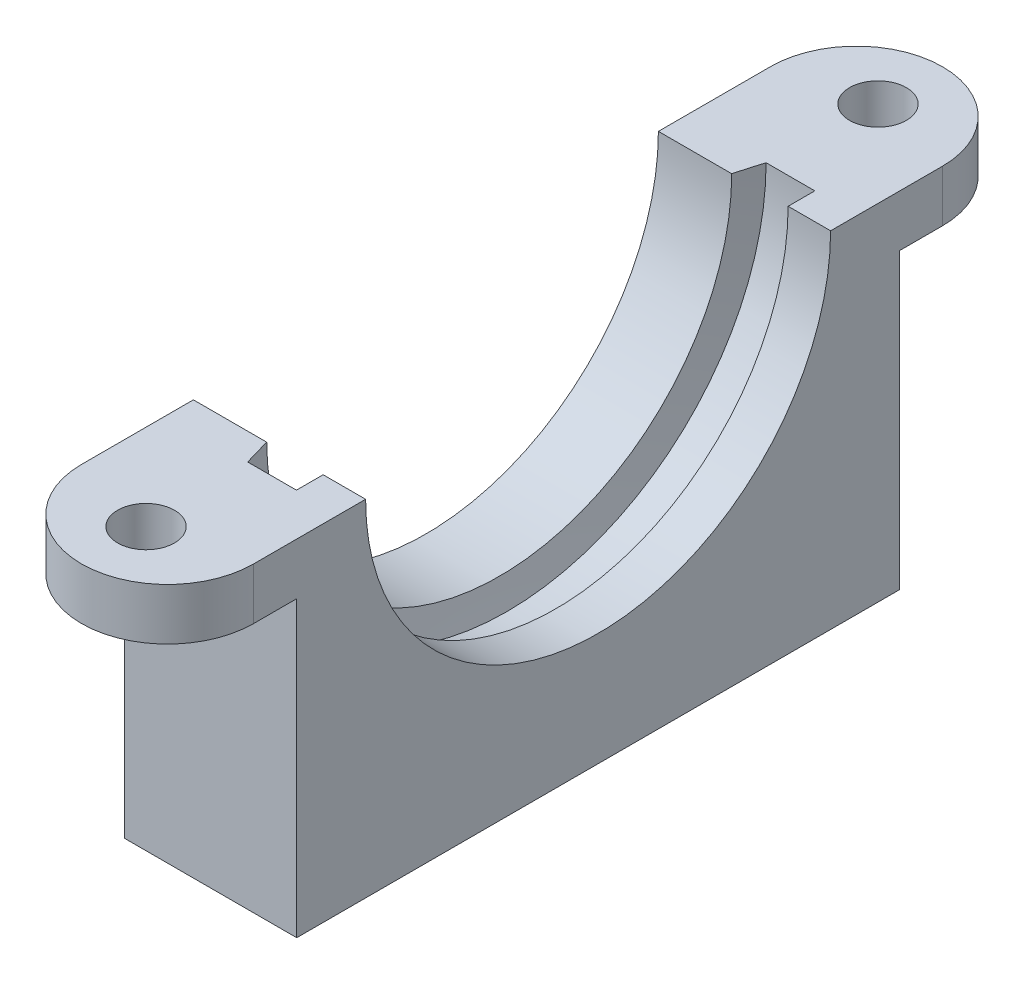
ISO-10303-21;
HEADER;
FILE_DESCRIPTION(('STEP AP214'),'2;1');
FILE_NAME('part.step','',(''),(''),'','','');
FILE_SCHEMA(('AUTOMOTIVE_DESIGN { 1 0 10303 214 1 1 1 1 }'));
ENDSEC;
DATA;
#1=APPLICATION_CONTEXT('core data for automotive mechanical design processes');
#2=APPLICATION_PROTOCOL_DEFINITION('international standard','automotive_design',2000,#1);
#3=PRODUCT_CONTEXT('',#1,'mechanical');
#4=PRODUCT('Part','Part','',(#3));
#5=PRODUCT_RELATED_PRODUCT_CATEGORY('part','',(#4));
#6=PRODUCT_DEFINITION_FORMATION('','',#4);
#7=PRODUCT_DEFINITION_CONTEXT('part definition',#1,'design');
#8=PRODUCT_DEFINITION('design','',#6,#7);
#9=PRODUCT_DEFINITION_SHAPE('','',#8);
#10=(LENGTH_UNIT() NAMED_UNIT(*) SI_UNIT(.MILLI.,.METRE.));
#11=(NAMED_UNIT(*) PLANE_ANGLE_UNIT() SI_UNIT($,.RADIAN.));
#12=(NAMED_UNIT(*) SI_UNIT($,.STERADIAN.) SOLID_ANGLE_UNIT());
#13=UNCERTAINTY_MEASURE_WITH_UNIT(LENGTH_MEASURE(1.E-05),#10,'distance_accuracy_value','');
#14=(GEOMETRIC_REPRESENTATION_CONTEXT(3) GLOBAL_UNCERTAINTY_ASSIGNED_CONTEXT((#13)) GLOBAL_UNIT_ASSIGNED_CONTEXT((#10,
#11,#12)) REPRESENTATION_CONTEXT('',''));
#15=CARTESIAN_POINT('',(0.,0.,0.));
#16=DIRECTION('',(0.,0.,1.));
#17=DIRECTION('',(1.,0.,0.));
#18=AXIS2_PLACEMENT_3D('',#15,#16,#17);
#19=CARTESIAN_POINT('',(0.,0.,-17.5));
#20=DIRECTION('',(0.,0.,-1.));
#21=DIRECTION('',(-1.,0.,0.));
#22=AXIS2_PLACEMENT_3D('',#19,#20,#21);
#23=PLANE('',#22);
#24=DIRECTION('',(0.,-1.,0.));
#25=VECTOR('',#24,1.);
#26=CARTESIAN_POINT('',(-7.53383666100945,0.,-17.5));
#27=LINE('',#26,#25);
#28=CARTESIAN_POINT('',(-7.53383666100945,-3.,-17.5));
#29=VERTEX_POINT('',#28);
#30=CARTESIAN_POINT('',(-7.53383666100945,-20.05,-17.5));
#31=VERTEX_POINT('',#30);
#32=EDGE_CURVE('E157',#29,#31,#27,.T.);
#33=ORIENTED_EDGE('',*,*,#32,.F.);
#34=DIRECTION('',(1.,0.,0.));
#35=VECTOR('',#34,1.);
#36=CARTESIAN_POINT('',(2.46616333899055,-3.,-17.5));
#37=LINE('',#36,#35);
#38=CARTESIAN_POINT('',(2.46616333899055,-3.,-17.5));
#39=VERTEX_POINT('',#38);
#40=EDGE_CURVE('E234',#29,#39,#37,.T.);
#41=ORIENTED_EDGE('',*,*,#40,.T.);
#42=DIRECTION('',(0.,-1.,0.));
#43=VECTOR('',#42,1.);
#44=CARTESIAN_POINT('',(2.46616333899055,0.,-17.5));
#45=LINE('',#44,#43);
#46=CARTESIAN_POINT('',(2.46616333899055,-20.05,-17.5));
#47=VERTEX_POINT('',#46);
#48=EDGE_CURVE('E169',#39,#47,#45,.T.);
#49=ORIENTED_EDGE('',*,*,#48,.T.);
#50=DIRECTION('',(1.,0.,0.));
#51=VECTOR('',#50,1.);
#52=CARTESIAN_POINT('',(-7.53383666100945,-20.05,-17.5));
#53=LINE('',#52,#51);
#54=EDGE_CURVE('E161',#31,#47,#53,.T.);
#55=ORIENTED_EDGE('',*,*,#54,.F.);
#56=EDGE_LOOP('',(#33,#41,#49,#55));
#57=FACE_BOUND('',#56,.T.);
#58=ADVANCED_FACE('F33',(#57),#23,.T.);
#59=CARTESIAN_POINT('',(-7.53383666100945,0.,17.5));
#60=DIRECTION('',(0.,1.,0.));
#61=DIRECTION('',(-1.,0.,0.));
#62=AXIS2_PLACEMENT_3D('',#59,#60,#61);
#63=PLANE('',#62);
#64=DIRECTION('',(-1.,0.,0.));
#65=VECTOR('',#64,1.);
#66=CARTESIAN_POINT('',(2.46616333899055,0.,-13.5));
#67=LINE('',#66,#65);
#68=CARTESIAN_POINT('',(2.46616333899055,0.,-13.5));
#69=VERTEX_POINT('',#68);
#70=CARTESIAN_POINT('',(0.,0.,-13.5));
#71=VERTEX_POINT('',#70);
#72=EDGE_CURVE('E220',#69,#71,#67,.T.);
#73=ORIENTED_EDGE('',*,*,#72,.F.);
#74=DIRECTION('',(0.,0.,-1.));
#75=VECTOR('',#74,1.);
#76=CARTESIAN_POINT('',(2.46616333899055,0.,17.5));
#77=LINE('',#76,#75);
#78=CARTESIAN_POINT('',(2.46616333899054,0.,-20.));
#79=VERTEX_POINT('',#78);
#80=EDGE_CURVE('E168',#69,#79,#77,.T.);
#81=ORIENTED_EDGE('',*,*,#80,.T.);
#82=CARTESIAN_POINT('',(-2.53383666100945,0.,-20.));
#83=DIRECTION('',(0.,1.,0.));
#84=DIRECTION('',(1.,0.,0.));
#85=AXIS2_PLACEMENT_3D('',#82,#83,#84);
#86=CIRCLE('',#85,4.99999999999999);
#87=CARTESIAN_POINT('',(-7.53383666100945,0.,-20.));
#88=VERTEX_POINT('',#87);
#89=EDGE_CURVE('E237',#79,#88,#86,.T.);
#90=ORIENTED_EDGE('',*,*,#89,.T.);
#91=DIRECTION('',(0.,0.,-1.));
#92=VECTOR('',#91,1.);
#93=CARTESIAN_POINT('',(-7.53383666100945,0.,17.5));
#94=LINE('',#93,#92);
#95=CARTESIAN_POINT('',(-7.53383666100945,0.,-13.5));
#96=VERTEX_POINT('',#95);
#97=EDGE_CURVE('E177',#96,#88,#94,.T.);
#98=ORIENTED_EDGE('',*,*,#97,.F.);
#99=CARTESIAN_POINT('',(-3.275063121647,0.,-13.5));
#100=VERTEX_POINT('',#99);
#101=EDGE_CURVE('E207',#100,#96,#67,.T.);
#102=ORIENTED_EDGE('',*,*,#101,.F.);
#103=CARTESIAN_POINT('',(46.6623266779811,0.,0.));
#104=DIRECTION('',(0.,1.,0.));
#105=DIRECTION('',(-1.,0.,0.));
#106=AXIS2_PLACEMENT_3D('',#103,#104,#105);
#107=CIRCLE('',#106,51.73);
#108=CARTESIAN_POINT('',(-2.83,0.,-15.05));
#109=VERTEX_POINT('',#108);
#110=EDGE_CURVE('E194',#100,#109,#107,.F.);
#111=ORIENTED_EDGE('',*,*,#110,.T.);
#112=DIRECTION('',(1.,0.,0.));
#113=VECTOR('',#112,1.);
#114=CARTESIAN_POINT('',(0.,0.,-15.05));
#115=LINE('',#114,#113);
#116=CARTESIAN_POINT('',(0.,0.,-15.05));
#117=VERTEX_POINT('',#116);
#118=EDGE_CURVE('E189',#117,#109,#115,.F.);
#119=ORIENTED_EDGE('',*,*,#118,.F.);
#120=DIRECTION('',(0.,0.,1.));
#121=VECTOR('',#120,1.);
#122=CARTESIAN_POINT('',(0.,0.,17.5));
#123=LINE('',#122,#121);
#124=EDGE_CURVE('E186',#117,#71,#123,.T.);
#125=ORIENTED_EDGE('',*,*,#124,.T.);
#126=EDGE_LOOP('',(#73,#81,#90,#98,#102,#111,#119,#125));
#127=FACE_BOUND('',#126,.T.);
#128=CARTESIAN_POINT('',(-2.53383666100945,0.,-21.25));
#129=DIRECTION('',(0.,1.,0.));
#130=DIRECTION('',(-1.,0.,0.));
#131=AXIS2_PLACEMENT_3D('',#128,#129,#130);
#132=CIRCLE('',#131,1.65);
#133=CARTESIAN_POINT('',(-4.18383666100945,0.,-21.25));
#134=VERTEX_POINT('',#133);
#135=EDGE_CURVE('E248',#134,#134,#132,.T.);
#136=ORIENTED_EDGE('',*,*,#135,.F.);
#137=EDGE_LOOP('',(#136));
#138=FACE_BOUND('',#137,.T.);
#139=ADVANCED_FACE('F204',(#127,#138),#63,.T.);
#140=DIRECTION('',(-1.,0.,0.));
#141=VECTOR('',#140,1.);
#142=CARTESIAN_POINT('',(2.46616333899055,0.,13.5));
#143=LINE('',#142,#141);
#144=CARTESIAN_POINT('',(-7.53383666100945,0.,13.5));
#145=VERTEX_POINT('',#144);
#146=CARTESIAN_POINT('',(-3.275063121647,0.,13.5));
#147=VERTEX_POINT('',#146);
#148=EDGE_CURVE('E218',#145,#147,#143,.F.);
#149=ORIENTED_EDGE('',*,*,#148,.F.);
#150=CARTESIAN_POINT('',(-7.53383666100945,0.,20.));
#151=VERTEX_POINT('',#150);
#152=EDGE_CURVE('E173',#151,#145,#94,.T.);
#153=ORIENTED_EDGE('',*,*,#152,.F.);
#154=CARTESIAN_POINT('',(-2.53383666100945,0.,20.));
#155=DIRECTION('',(0.,1.,0.));
#156=DIRECTION('',(1.,0.,0.));
#157=AXIS2_PLACEMENT_3D('',#154,#155,#156);
#158=CIRCLE('',#157,5.);
#159=CARTESIAN_POINT('',(2.46616333899055,0.,20.));
#160=VERTEX_POINT('',#159);
#161=EDGE_CURVE('E151',#151,#160,#158,.T.);
#162=ORIENTED_EDGE('',*,*,#161,.T.);
#163=CARTESIAN_POINT('',(2.46616333899055,0.,13.5));
#164=VERTEX_POINT('',#163);
#165=EDGE_CURVE('E183',#160,#164,#77,.T.);
#166=ORIENTED_EDGE('',*,*,#165,.T.);
#167=CARTESIAN_POINT('',(0.,0.,13.5));
#168=VERTEX_POINT('',#167);
#169=EDGE_CURVE('E224',#168,#164,#143,.F.);
#170=ORIENTED_EDGE('',*,*,#169,.F.);
#171=CARTESIAN_POINT('',(0.,0.,15.05));
#172=VERTEX_POINT('',#171);
#173=EDGE_CURVE('E176',#168,#172,#123,.T.);
#174=ORIENTED_EDGE('',*,*,#173,.T.);
#175=DIRECTION('',(1.,0.,0.));
#176=VECTOR('',#175,1.);
#177=CARTESIAN_POINT('',(0.,0.,15.05));
#178=LINE('',#177,#176);
#179=CARTESIAN_POINT('',(-2.83,0.,15.05));
#180=VERTEX_POINT('',#179);
#181=EDGE_CURVE('E192',#180,#172,#178,.T.);
#182=ORIENTED_EDGE('',*,*,#181,.F.);
#183=EDGE_CURVE('E41',#180,#147,#107,.F.);
#184=ORIENTED_EDGE('',*,*,#183,.T.);
#185=EDGE_LOOP('',(#149,#153,#162,#166,#170,#174,#182,#184));
#186=FACE_BOUND('',#185,.T.);
#187=CARTESIAN_POINT('',(-2.53383666100945,0.,21.25));
#188=DIRECTION('',(0.,1.,0.));
#189=DIRECTION('',(-1.,0.,0.));
#190=AXIS2_PLACEMENT_3D('',#187,#188,#189);
#191=CIRCLE('',#190,1.65);
#192=CARTESIAN_POINT('',(-4.18383666100945,0.,21.25));
#193=VERTEX_POINT('',#192);
#194=EDGE_CURVE('E263',#193,#193,#191,.T.);
#195=ORIENTED_EDGE('',*,*,#194,.F.);
#196=EDGE_LOOP('',(#195));
#197=FACE_BOUND('',#196,.T.);
#198=ADVANCED_FACE('F35',(#186,#197),#63,.T.);
#199=CARTESIAN_POINT('',(-7.53383666100945,0.,17.5));
#200=DIRECTION('',(1.,0.,0.));
#201=DIRECTION('',(0.,1.,0.));
#202=AXIS2_PLACEMENT_3D('',#199,#200,#201);
#203=PLANE('',#202);
#204=ORIENTED_EDGE('',*,*,#152,.T.);
#205=CARTESIAN_POINT('',(-7.53383666100945,0.,0.));
#206=DIRECTION('',(-1.,0.,0.));
#207=DIRECTION('',(0.,-1.,0.));
#208=AXIS2_PLACEMENT_3D('',#205,#206,#207);
#209=CIRCLE('',#208,13.5);
#210=EDGE_CURVE('E227',#96,#145,#209,.T.);
#211=ORIENTED_EDGE('',*,*,#210,.F.);
#212=ORIENTED_EDGE('',*,*,#97,.T.);
#213=DIRECTION('',(0.,1.,0.));
#214=VECTOR('',#213,1.);
#215=CARTESIAN_POINT('',(-7.53383666100945,-3.,-20.));
#216=LINE('',#215,#214);
#217=CARTESIAN_POINT('',(-7.53383666100945,-3.,-20.));
#218=VERTEX_POINT('',#217);
#219=EDGE_CURVE('E229',#218,#88,#216,.T.);
#220=ORIENTED_EDGE('',*,*,#219,.F.);
#221=DIRECTION('',(0.,0.,1.));
#222=VECTOR('',#221,1.);
#223=CARTESIAN_POINT('',(-7.53383666100945,-3.,-17.5));
#224=LINE('',#223,#222);
#225=EDGE_CURVE('E242',#218,#29,#224,.T.);
#226=ORIENTED_EDGE('',*,*,#225,.T.);
#227=ORIENTED_EDGE('',*,*,#32,.T.);
#228=DIRECTION('',(0.,0.,-1.));
#229=VECTOR('',#228,1.);
#230=CARTESIAN_POINT('',(-7.53383666100945,-20.05,17.5));
#231=LINE('',#230,#229);
#232=CARTESIAN_POINT('',(-7.53383666100945,-20.05,17.5));
#233=VERTEX_POINT('',#232);
#234=EDGE_CURVE('E178',#233,#31,#231,.T.);
#235=ORIENTED_EDGE('',*,*,#234,.F.);
#236=DIRECTION('',(0.,-1.,0.));
#237=VECTOR('',#236,1.);
#238=CARTESIAN_POINT('',(-7.53383666100945,0.,17.5));
#239=LINE('',#238,#237);
#240=CARTESIAN_POINT('',(-7.53383666100945,-3.,17.5));
#241=VERTEX_POINT('',#240);
#242=EDGE_CURVE('E159',#241,#233,#239,.T.);
#243=ORIENTED_EDGE('',*,*,#242,.F.);
#244=DIRECTION('',(0.,0.,1.));
#245=VECTOR('',#244,1.);
#246=CARTESIAN_POINT('',(-7.53383666100945,-3.,17.5));
#247=LINE('',#246,#245);
#248=CARTESIAN_POINT('',(-7.53383666100945,-3.,20.));
#249=VERTEX_POINT('',#248);
#250=EDGE_CURVE('E48',#241,#249,#247,.T.);
#251=ORIENTED_EDGE('',*,*,#250,.T.);
#252=DIRECTION('',(0.,1.,0.));
#253=VECTOR('',#252,1.);
#254=CARTESIAN_POINT('',(-7.53383666100945,-3.,20.));
#255=LINE('',#254,#253);
#256=EDGE_CURVE('E253',#249,#151,#255,.T.);
#257=ORIENTED_EDGE('',*,*,#256,.T.);
#258=EDGE_LOOP('',(#204,#211,#212,#220,#226,#227,#235,#243,#251,#257));
#259=FACE_BOUND('',#258,.T.);
#260=ADVANCED_FACE('F277',(#259),#203,.F.);
#261=CARTESIAN_POINT('',(-7.53383666100945,-20.05,17.5));
#262=DIRECTION('',(0.,1.,0.));
#263=DIRECTION('',(0.,0.,1.));
#264=AXIS2_PLACEMENT_3D('',#261,#262,#263);
#265=PLANE('',#264);
#266=ORIENTED_EDGE('',*,*,#54,.T.);
#267=DIRECTION('',(0.,0.,-1.));
#268=VECTOR('',#267,1.);
#269=CARTESIAN_POINT('',(2.46616333899055,-20.05,17.5));
#270=LINE('',#269,#268);
#271=CARTESIAN_POINT('',(2.46616333899055,-20.05,17.5));
#272=VERTEX_POINT('',#271);
#273=EDGE_CURVE('E181',#272,#47,#270,.T.);
#274=ORIENTED_EDGE('',*,*,#273,.F.);
#275=DIRECTION('',(1.,0.,0.));
#276=VECTOR('',#275,1.);
#277=CARTESIAN_POINT('',(-7.53383666100945,-20.05,17.5));
#278=LINE('',#277,#276);
#279=EDGE_CURVE('E155',#233,#272,#278,.T.);
#280=ORIENTED_EDGE('',*,*,#279,.F.);
#281=ORIENTED_EDGE('',*,*,#234,.T.);
#282=EDGE_LOOP('',(#266,#274,#280,#281));
#283=FACE_BOUND('',#282,.T.);
#284=ADVANCED_FACE('F282',(#283),#265,.F.);
#285=CARTESIAN_POINT('',(2.46616333899055,0.,17.5));
#286=DIRECTION('',(1.,0.,0.));
#287=DIRECTION('',(0.,1.,0.));
#288=AXIS2_PLACEMENT_3D('',#285,#286,#287);
#289=PLANE('',#288);
#290=CARTESIAN_POINT('',(2.46616333899055,0.,0.));
#291=DIRECTION('',(-1.,0.,0.));
#292=DIRECTION('',(0.,-1.,0.));
#293=AXIS2_PLACEMENT_3D('',#290,#291,#292);
#294=CIRCLE('',#293,13.5);
#295=EDGE_CURVE('E226',#69,#164,#294,.T.);
#296=ORIENTED_EDGE('',*,*,#295,.T.);
#297=ORIENTED_EDGE('',*,*,#165,.F.);
#298=DIRECTION('',(0.,1.,0.));
#299=VECTOR('',#298,1.);
#300=CARTESIAN_POINT('',(2.46616333899055,-3.,20.));
#301=LINE('',#300,#299);
#302=CARTESIAN_POINT('',(2.46616333899055,-3.,20.));
#303=VERTEX_POINT('',#302);
#304=EDGE_CURVE('E150',#303,#160,#301,.T.);
#305=ORIENTED_EDGE('',*,*,#304,.F.);
#306=DIRECTION('',(0.,0.,-1.));
#307=VECTOR('',#306,1.);
#308=CARTESIAN_POINT('',(2.46616333899055,-3.,17.5));
#309=LINE('',#308,#307);
#310=CARTESIAN_POINT('',(2.46616333899055,-3.,17.5));
#311=VERTEX_POINT('',#310);
#312=EDGE_CURVE('E137',#303,#311,#309,.T.);
#313=ORIENTED_EDGE('',*,*,#312,.T.);
#314=DIRECTION('',(0.,-1.,0.));
#315=VECTOR('',#314,1.);
#316=CARTESIAN_POINT('',(2.46616333899055,0.,17.5));
#317=LINE('',#316,#315);
#318=EDGE_CURVE('E147',#311,#272,#317,.T.);
#319=ORIENTED_EDGE('',*,*,#318,.T.);
#320=ORIENTED_EDGE('',*,*,#273,.T.);
#321=ORIENTED_EDGE('',*,*,#48,.F.);
#322=DIRECTION('',(0.,0.,-1.));
#323=VECTOR('',#322,1.);
#324=CARTESIAN_POINT('',(2.46616333899055,-3.,-17.5));
#325=LINE('',#324,#323);
#326=CARTESIAN_POINT('',(2.46616333899054,-3.,-20.));
#327=VERTEX_POINT('',#326);
#328=EDGE_CURVE('E56',#39,#327,#325,.T.);
#329=ORIENTED_EDGE('',*,*,#328,.T.);
#330=DIRECTION('',(0.,1.,0.));
#331=VECTOR('',#330,1.);
#332=CARTESIAN_POINT('',(2.46616333899054,-3.,-20.));
#333=LINE('',#332,#331);
#334=EDGE_CURVE('E231',#327,#79,#333,.T.);
#335=ORIENTED_EDGE('',*,*,#334,.T.);
#336=ORIENTED_EDGE('',*,*,#80,.F.);
#337=EDGE_LOOP('',(#296,#297,#305,#313,#319,#320,#321,#329,#335,#336));
#338=FACE_BOUND('',#337,.T.);
#339=ADVANCED_FACE('F145',(#338),#289,.T.);
#340=CARTESIAN_POINT('',(0.,0.,17.5));
#341=DIRECTION('',(0.,0.,-1.));
#342=DIRECTION('',(-1.,0.,0.));
#343=AXIS2_PLACEMENT_3D('',#340,#341,#342);
#344=PLANE('',#343);
#345=ORIENTED_EDGE('',*,*,#318,.F.);
#346=DIRECTION('',(-1.,0.,0.));
#347=VECTOR('',#346,1.);
#348=CARTESIAN_POINT('',(2.46616333899055,-3.,17.5));
#349=LINE('',#348,#347);
#350=EDGE_CURVE('E134',#311,#241,#349,.T.);
#351=ORIENTED_EDGE('',*,*,#350,.T.);
#352=ORIENTED_EDGE('',*,*,#242,.T.);
#353=ORIENTED_EDGE('',*,*,#279,.T.);
#354=EDGE_LOOP('',(#345,#351,#352,#353));
#355=FACE_BOUND('',#354,.T.);
#356=ADVANCED_FACE('F153',(#355),#344,.F.);
#357=CARTESIAN_POINT('',(46.6623266779811,0.,0.));
#358=DIRECTION('',(1.,0.,0.));
#359=DIRECTION('',(0.,1.,0.));
#360=AXIS2_PLACEMENT_3D('',#357,#358,#359);
#361=SPHERICAL_SURFACE('',#360,51.73);
#362=CARTESIAN_POINT('',(-3.275063121647,0.,0.));
#363=DIRECTION('',(1.,0.,0.));
#364=DIRECTION('',(0.,1.,0.));
#365=AXIS2_PLACEMENT_3D('',#362,#363,#364);
#366=CIRCLE('',#365,13.5);
#367=EDGE_CURVE('E222',#147,#100,#366,.T.);
#368=ORIENTED_EDGE('',*,*,#367,.F.);
#369=ORIENTED_EDGE('',*,*,#183,.F.);
#370=CARTESIAN_POINT('',(-2.83,0.,0.));
#371=DIRECTION('',(1.,0.,0.));
#372=DIRECTION('',(0.,0.,-1.));
#373=AXIS2_PLACEMENT_3D('',#370,#371,#372);
#374=CIRCLE('',#373,15.05);
#375=EDGE_CURVE('E164',#180,#109,#374,.T.);
#376=ORIENTED_EDGE('',*,*,#375,.T.);
#377=ORIENTED_EDGE('',*,*,#110,.F.);
#378=EDGE_LOOP('',(#368,#369,#376,#377));
#379=FACE_BOUND('',#378,.T.);
#380=ADVANCED_FACE('F217',(#379),#361,.F.);
#381=CARTESIAN_POINT('',(0.,0.,0.));
#382=DIRECTION('',(1.,0.,0.));
#383=DIRECTION('',(0.,0.,-1.));
#384=AXIS2_PLACEMENT_3D('',#381,#382,#383);
#385=CYLINDRICAL_SURFACE('',#384,15.05);
#386=ORIENTED_EDGE('',*,*,#181,.T.);
#387=CARTESIAN_POINT('',(0.,0.,0.));
#388=DIRECTION('',(1.,0.,0.));
#389=DIRECTION('',(0.,0.,-1.));
#390=AXIS2_PLACEMENT_3D('',#387,#388,#389);
#391=CIRCLE('',#390,15.05);
#392=EDGE_CURVE('E216',#172,#117,#391,.T.);
#393=ORIENTED_EDGE('',*,*,#392,.T.);
#394=ORIENTED_EDGE('',*,*,#118,.T.);
#395=ORIENTED_EDGE('',*,*,#375,.F.);
#396=EDGE_LOOP('',(#386,#393,#394,#395));
#397=FACE_BOUND('',#396,.T.);
#398=ADVANCED_FACE('F214',(#397),#385,.F.);
#399=CARTESIAN_POINT('',(0.,15.05,0.));
#400=DIRECTION('',(-1.,0.,0.));
#401=DIRECTION('',(0.,0.,1.));
#402=AXIS2_PLACEMENT_3D('',#399,#400,#401);
#403=PLANE('',#402);
#404=CARTESIAN_POINT('',(0.,0.,0.));
#405=DIRECTION('',(-1.,0.,0.));
#406=DIRECTION('',(0.,0.,1.));
#407=AXIS2_PLACEMENT_3D('',#404,#405,#406);
#408=CIRCLE('',#407,13.5);
#409=EDGE_CURVE('E11',#71,#168,#408,.T.);
#410=ORIENTED_EDGE('',*,*,#409,.F.);
#411=ORIENTED_EDGE('',*,*,#124,.F.);
#412=ORIENTED_EDGE('',*,*,#392,.F.);
#413=ORIENTED_EDGE('',*,*,#173,.F.);
#414=EDGE_LOOP('',(#410,#411,#412,#413));
#415=FACE_BOUND('',#414,.T.);
#416=ADVANCED_FACE('F306',(#415),#403,.T.);
#417=CARTESIAN_POINT('',(2.46616333899055,0.,0.));
#418=DIRECTION('',(-1.,0.,0.));
#419=DIRECTION('',(0.,-1.,0.));
#420=AXIS2_PLACEMENT_3D('',#417,#418,#419);
#421=CYLINDRICAL_SURFACE('',#420,13.5);
#422=ORIENTED_EDGE('',*,*,#72,.T.);
#423=ORIENTED_EDGE('',*,*,#409,.T.);
#424=ORIENTED_EDGE('',*,*,#169,.T.);
#425=ORIENTED_EDGE('',*,*,#295,.F.);
#426=EDGE_LOOP('',(#422,#423,#424,#425));
#427=FACE_BOUND('',#426,.T.);
#428=ADVANCED_FACE('F311',(#427),#421,.F.);
#429=ORIENTED_EDGE('',*,*,#101,.T.);
#430=ORIENTED_EDGE('',*,*,#210,.T.);
#431=ORIENTED_EDGE('',*,*,#148,.T.);
#432=ORIENTED_EDGE('',*,*,#367,.T.);
#433=EDGE_LOOP('',(#429,#430,#431,#432));
#434=FACE_BOUND('',#433,.T.);
#435=ADVANCED_FACE('F315',(#434),#421,.F.);
#436=CARTESIAN_POINT('',(-2.53383666100945,-3.,-20.));
#437=DIRECTION('',(0.,1.,0.));
#438=DIRECTION('',(-1.,0.,0.));
#439=AXIS2_PLACEMENT_3D('',#436,#437,#438);
#440=CYLINDRICAL_SURFACE('',#439,4.99999999999999);
#441=ORIENTED_EDGE('',*,*,#89,.F.);
#442=ORIENTED_EDGE('',*,*,#334,.F.);
#443=CARTESIAN_POINT('',(-2.53383666100945,-3.,-20.));
#444=DIRECTION('',(0.,1.,0.));
#445=DIRECTION('',(1.,0.,0.));
#446=AXIS2_PLACEMENT_3D('',#443,#444,#445);
#447=CIRCLE('',#446,4.99999999999999);
#448=EDGE_CURVE('E244',#327,#218,#447,.T.);
#449=ORIENTED_EDGE('',*,*,#448,.T.);
#450=ORIENTED_EDGE('',*,*,#219,.T.);
#451=EDGE_LOOP('',(#441,#442,#449,#450));
#452=FACE_BOUND('',#451,.T.);
#453=ADVANCED_FACE('F317',(#452),#440,.T.);
#454=CARTESIAN_POINT('',(-2.53383666100945,-3.,-20.));
#455=DIRECTION('',(0.,-1.,0.));
#456=DIRECTION('',(1.,0.,0.));
#457=AXIS2_PLACEMENT_3D('',#454,#455,#456);
#458=PLANE('',#457);
#459=CARTESIAN_POINT('',(-2.53383666100945,-3.,-21.25));
#460=DIRECTION('',(0.,1.,0.));
#461=DIRECTION('',(-1.,0.,0.));
#462=AXIS2_PLACEMENT_3D('',#459,#460,#461);
#463=CIRCLE('',#462,1.65);
#464=CARTESIAN_POINT('',(-4.18383666100945,-3.,-21.25));
#465=VERTEX_POINT('',#464);
#466=EDGE_CURVE('E240',#465,#465,#463,.T.);
#467=ORIENTED_EDGE('',*,*,#466,.T.);
#468=EDGE_LOOP('',(#467));
#469=FACE_BOUND('',#468,.T.);
#470=ORIENTED_EDGE('',*,*,#328,.F.);
#471=ORIENTED_EDGE('',*,*,#40,.F.);
#472=ORIENTED_EDGE('',*,*,#225,.F.);
#473=ORIENTED_EDGE('',*,*,#448,.F.);
#474=EDGE_LOOP('',(#470,#471,#472,#473));
#475=FACE_BOUND('',#474,.T.);
#476=ADVANCED_FACE('F320',(#469,#475),#458,.T.);
#477=CARTESIAN_POINT('',(-2.53383666100945,-3.,-21.25));
#478=DIRECTION('',(0.,1.,0.));
#479=DIRECTION('',(-1.,0.,0.));
#480=AXIS2_PLACEMENT_3D('',#477,#478,#479);
#481=CYLINDRICAL_SURFACE('',#480,1.65);
#482=ORIENTED_EDGE('',*,*,#466,.F.);
#483=EDGE_LOOP('',(#482));
#484=FACE_BOUND('',#483,.T.);
#485=ORIENTED_EDGE('',*,*,#135,.T.);
#486=EDGE_LOOP('',(#485));
#487=FACE_BOUND('',#486,.T.);
#488=ADVANCED_FACE('F324',(#484,#487),#481,.F.);
#489=CARTESIAN_POINT('',(-2.53383666100945,-3.,20.));
#490=DIRECTION('',(0.,1.,0.));
#491=DIRECTION('',(-1.,0.,0.));
#492=AXIS2_PLACEMENT_3D('',#489,#490,#491);
#493=CYLINDRICAL_SURFACE('',#492,5.);
#494=ORIENTED_EDGE('',*,*,#161,.F.);
#495=ORIENTED_EDGE('',*,*,#256,.F.);
#496=CARTESIAN_POINT('',(-2.53383666100945,-3.,20.));
#497=DIRECTION('',(0.,1.,0.));
#498=DIRECTION('',(1.,0.,0.));
#499=AXIS2_PLACEMENT_3D('',#496,#497,#498);
#500=CIRCLE('',#499,5.);
#501=EDGE_CURVE('E256',#249,#303,#500,.T.);
#502=ORIENTED_EDGE('',*,*,#501,.T.);
#503=ORIENTED_EDGE('',*,*,#304,.T.);
#504=EDGE_LOOP('',(#494,#495,#502,#503));
#505=FACE_BOUND('',#504,.T.);
#506=ADVANCED_FACE('F328',(#505),#493,.T.);
#507=CARTESIAN_POINT('',(-2.53383666100945,-3.,20.));
#508=DIRECTION('',(0.,-1.,0.));
#509=DIRECTION('',(1.,0.,0.));
#510=AXIS2_PLACEMENT_3D('',#507,#508,#509);
#511=PLANE('',#510);
#512=CARTESIAN_POINT('',(-2.53383666100945,-3.,21.25));
#513=DIRECTION('',(0.,1.,0.));
#514=DIRECTION('',(-1.,0.,0.));
#515=AXIS2_PLACEMENT_3D('',#512,#513,#514);
#516=CIRCLE('',#515,1.65);
#517=CARTESIAN_POINT('',(-4.18383666100945,-3.,21.25));
#518=VERTEX_POINT('',#517);
#519=EDGE_CURVE('E260',#518,#518,#516,.T.);
#520=ORIENTED_EDGE('',*,*,#519,.T.);
#521=EDGE_LOOP('',(#520));
#522=FACE_BOUND('',#521,.T.);
#523=ORIENTED_EDGE('',*,*,#312,.F.);
#524=ORIENTED_EDGE('',*,*,#501,.F.);
#525=ORIENTED_EDGE('',*,*,#250,.F.);
#526=ORIENTED_EDGE('',*,*,#350,.F.);
#527=EDGE_LOOP('',(#523,#524,#525,#526));
#528=FACE_BOUND('',#527,.T.);
#529=ADVANCED_FACE('F136',(#522,#528),#511,.T.);
#530=CARTESIAN_POINT('',(-2.53383666100945,-3.,21.25));
#531=DIRECTION('',(0.,1.,0.));
#532=DIRECTION('',(-1.,0.,0.));
#533=AXIS2_PLACEMENT_3D('',#530,#531,#532);
#534=CYLINDRICAL_SURFACE('',#533,1.65);
#535=ORIENTED_EDGE('',*,*,#519,.F.);
#536=EDGE_LOOP('',(#535));
#537=FACE_BOUND('',#536,.T.);
#538=ORIENTED_EDGE('',*,*,#194,.T.);
#539=EDGE_LOOP('',(#538));
#540=FACE_BOUND('',#539,.T.);
#541=ADVANCED_FACE('F270',(#537,#540),#534,.F.);
#542=CLOSED_SHELL('',(#58,#139,#198,#260,#284,#339,#356,#380,#398,#416,#428,#435,#453,#476,#488,
#506,#529,#541));
#543=MANIFOLD_SOLID_BREP('B2',#542);
#544=ADVANCED_BREP_SHAPE_REPRESENTATION('',(#18,#543),#14);
#545=SHAPE_DEFINITION_REPRESENTATION(#9,#544);
ENDSEC;
END-ISO-10303-21;
